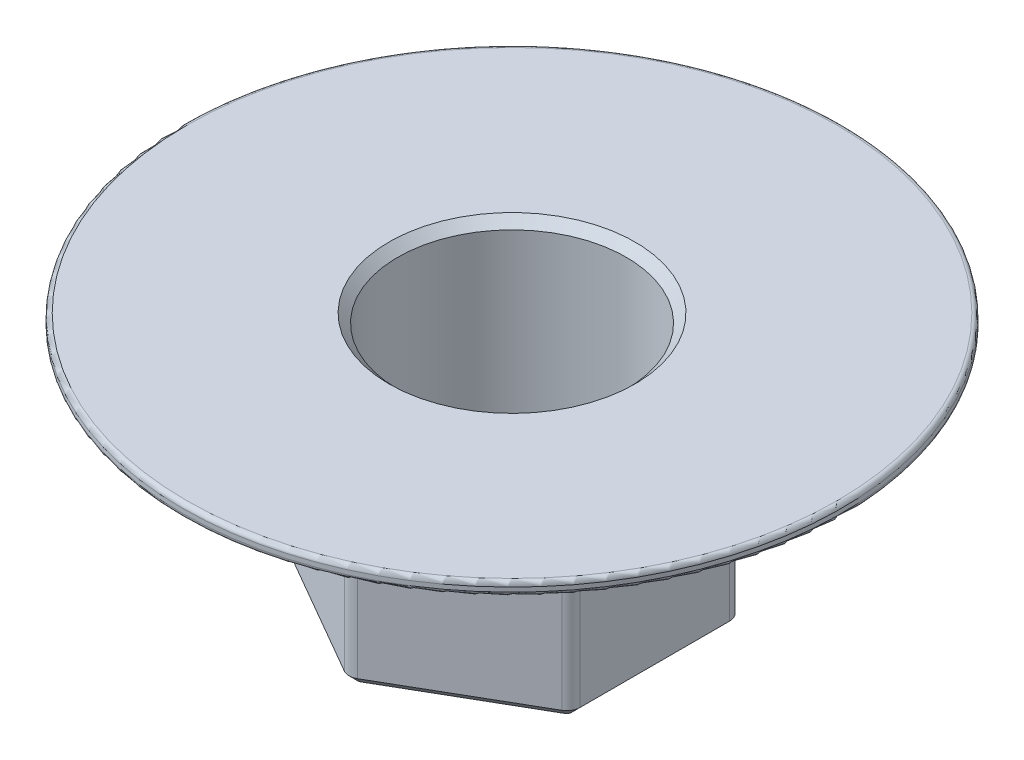
ISO-10303-21;
HEADER;
FILE_DESCRIPTION(('STEP AP214'),'2;1');
FILE_NAME('part.step','',(''),(''),'','','');
FILE_SCHEMA(('AUTOMOTIVE_DESIGN { 1 0 10303 214 1 1 1 1 }'));
ENDSEC;
DATA;
#1=APPLICATION_CONTEXT('core data for automotive mechanical design processes');
#2=APPLICATION_PROTOCOL_DEFINITION('international standard','automotive_design',2000,#1);
#3=PRODUCT_CONTEXT('',#1,'mechanical');
#4=PRODUCT('Part','Part','',(#3));
#5=PRODUCT_RELATED_PRODUCT_CATEGORY('part','',(#4));
#6=PRODUCT_DEFINITION_FORMATION('','',#4);
#7=PRODUCT_DEFINITION_CONTEXT('part definition',#1,'design');
#8=PRODUCT_DEFINITION('design','',#6,#7);
#9=PRODUCT_DEFINITION_SHAPE('','',#8);
#10=(LENGTH_UNIT() NAMED_UNIT(*) SI_UNIT(.MILLI.,.METRE.));
#11=(NAMED_UNIT(*) PLANE_ANGLE_UNIT() SI_UNIT($,.RADIAN.));
#12=(NAMED_UNIT(*) SI_UNIT($,.STERADIAN.) SOLID_ANGLE_UNIT());
#13=UNCERTAINTY_MEASURE_WITH_UNIT(LENGTH_MEASURE(1.E-05),#10,'distance_accuracy_value','');
#14=(GEOMETRIC_REPRESENTATION_CONTEXT(3) GLOBAL_UNCERTAINTY_ASSIGNED_CONTEXT((#13)) GLOBAL_UNIT_ASSIGNED_CONTEXT((#10,
#11,#12)) REPRESENTATION_CONTEXT('',''));
#15=CARTESIAN_POINT('',(0.,0.,0.));
#16=DIRECTION('',(0.,0.,1.));
#17=DIRECTION('',(1.,0.,0.));
#18=AXIS2_PLACEMENT_3D('',#15,#16,#17);
#19=CARTESIAN_POINT('',(0.,0.,0.));
#20=DIRECTION('',(0.,1.,0.));
#21=DIRECTION('',(0.,0.,1.));
#22=AXIS2_PLACEMENT_3D('',#19,#20,#21);
#23=PLANE('',#22);
#24=CARTESIAN_POINT('',(29.5,0.,-17.031832941094));
#25=DIRECTION('',(0.,1.,0.));
#26=DIRECTION('',(0.,0.,1.));
#27=AXIS2_PLACEMENT_3D('',#24,#25,#26);
#28=CIRCLE('',#27,0.999999999999997);
#29=CARTESIAN_POINT('',(30.,0.,-17.8978583448784));
#30=VERTEX_POINT('',#29);
#31=CARTESIAN_POINT('',(30.5,0.,-17.031832941094));
#32=VERTEX_POINT('',#31);
#33=EDGE_CURVE('E227',#30,#32,#28,.F.);
#34=ORIENTED_EDGE('',*,*,#33,.T.);
#35=DIRECTION('',(0.,0.,1.));
#36=VECTOR('',#35,1.);
#37=CARTESIAN_POINT('',(30.5,0.,17.031832941094));
#38=LINE('',#37,#36);
#39=CARTESIAN_POINT('',(30.5,0.,17.031832941094));
#40=VERTEX_POINT('',#39);
#41=EDGE_CURVE('E229',#32,#40,#38,.T.);
#42=ORIENTED_EDGE('',*,*,#41,.T.);
#43=CARTESIAN_POINT('',(29.5,0.,17.031832941094));
#44=DIRECTION('',(0.,1.,0.));
#45=DIRECTION('',(0.,0.,1.));
#46=AXIS2_PLACEMENT_3D('',#43,#44,#45);
#47=CIRCLE('',#46,0.999999999999998);
#48=CARTESIAN_POINT('',(30.,0.,17.8978583448784));
#49=VERTEX_POINT('',#48);
#50=EDGE_CURVE('E225',#40,#49,#47,.F.);
#51=ORIENTED_EDGE('',*,*,#50,.T.);
#52=DIRECTION('',(-0.866025403784439,0.,0.5));
#53=VECTOR('',#52,1.);
#54=CARTESIAN_POINT('',(0.499999999999995,0.,34.9296912859724));
#55=LINE('',#54,#53);
#56=CARTESIAN_POINT('',(0.500000000000002,0.,34.9296912859723));
#57=VERTEX_POINT('',#56);
#58=EDGE_CURVE('E221',#49,#57,#55,.T.);
#59=ORIENTED_EDGE('',*,*,#58,.T.);
#60=CARTESIAN_POINT('',(0.,0.,34.0636658821879));
#61=DIRECTION('',(0.,1.,0.));
#62=DIRECTION('',(0.,0.,1.));
#63=AXIS2_PLACEMENT_3D('',#60,#61,#62);
#64=CIRCLE('',#63,0.999999999999997);
#65=CARTESIAN_POINT('',(-0.499999999999999,0.,34.9296912859724));
#66=VERTEX_POINT('',#65);
#67=EDGE_CURVE('E217',#57,#66,#64,.F.);
#68=ORIENTED_EDGE('',*,*,#67,.T.);
#69=DIRECTION('',(-0.866025403784439,0.,-0.5));
#70=VECTOR('',#69,1.);
#71=CARTESIAN_POINT('',(-30.,0.,17.8978583448784));
#72=LINE('',#71,#70);
#73=CARTESIAN_POINT('',(-30.,0.,17.8978583448784));
#74=VERTEX_POINT('',#73);
#75=EDGE_CURVE('E213',#66,#74,#72,.T.);
#76=ORIENTED_EDGE('',*,*,#75,.T.);
#77=CARTESIAN_POINT('',(-29.5,0.,17.031832941094));
#78=DIRECTION('',(0.,1.,0.));
#79=DIRECTION('',(0.,0.,1.));
#80=AXIS2_PLACEMENT_3D('',#77,#78,#79);
#81=CIRCLE('',#80,0.999999999999997);
#82=CARTESIAN_POINT('',(-30.5,0.,17.031832941094));
#83=VERTEX_POINT('',#82);
#84=EDGE_CURVE('E209',#74,#83,#81,.F.);
#85=ORIENTED_EDGE('',*,*,#84,.T.);
#86=DIRECTION('',(0.,0.,-1.));
#87=VECTOR('',#86,1.);
#88=CARTESIAN_POINT('',(-30.5,0.,-17.031832941094));
#89=LINE('',#88,#87);
#90=CARTESIAN_POINT('',(-30.5,0.,-17.031832941094));
#91=VERTEX_POINT('',#90);
#92=EDGE_CURVE('E202',#83,#91,#89,.T.);
#93=ORIENTED_EDGE('',*,*,#92,.T.);
#94=CARTESIAN_POINT('',(-29.5,0.,-17.031832941094));
#95=DIRECTION('',(0.,1.,0.));
#96=DIRECTION('',(0.,0.,1.));
#97=AXIS2_PLACEMENT_3D('',#94,#95,#96);
#98=CIRCLE('',#97,0.999999999999999);
#99=CARTESIAN_POINT('',(-30.,0.,-17.8978583448784));
#100=VERTEX_POINT('',#99);
#101=EDGE_CURVE('E211',#91,#100,#98,.F.);
#102=ORIENTED_EDGE('',*,*,#101,.T.);
#103=DIRECTION('',(0.866025403784439,0.,-0.5));
#104=VECTOR('',#103,1.);
#105=CARTESIAN_POINT('',(-0.500000000000003,0.,-34.9296912859724));
#106=LINE('',#105,#104);
#107=CARTESIAN_POINT('',(-0.500000000000006,0.,-34.9296912859724));
#108=VERTEX_POINT('',#107);
#109=EDGE_CURVE('E215',#100,#108,#106,.T.);
#110=ORIENTED_EDGE('',*,*,#109,.T.);
#111=CARTESIAN_POINT('',(0.,0.,-34.0636658821879));
#112=DIRECTION('',(0.,1.,0.));
#113=DIRECTION('',(0.,0.,1.));
#114=AXIS2_PLACEMENT_3D('',#111,#112,#113);
#115=CIRCLE('',#114,0.999999999999997);
#116=CARTESIAN_POINT('',(0.499999999999989,0.,-34.9296912859724));
#117=VERTEX_POINT('',#116);
#118=EDGE_CURVE('E219',#108,#117,#115,.F.);
#119=ORIENTED_EDGE('',*,*,#118,.T.);
#120=DIRECTION('',(0.866025403784439,0.,0.5));
#121=VECTOR('',#120,1.);
#122=CARTESIAN_POINT('',(30.,0.,-17.8978583448784));
#123=LINE('',#122,#121);
#124=EDGE_CURVE('E223',#117,#30,#123,.T.);
#125=ORIENTED_EDGE('',*,*,#124,.T.);
#126=EDGE_LOOP('',(#34,#42,#51,#59,#68,#76,#85,#93,#102,#110,#119,#125));
#127=FACE_BOUND('',#126,.T.);
#128=CARTESIAN_POINT('',(0.,0.,0.));
#129=DIRECTION('',(0.,1.,0.));
#130=DIRECTION('',(0.,0.,1.));
#131=AXIS2_PLACEMENT_3D('',#128,#129,#130);
#132=CIRCLE('',#131,26.);
#133=CARTESIAN_POINT('',(0.,0.,26.));
#134=VERTEX_POINT('',#133);
#135=EDGE_CURVE('E181',#134,#134,#132,.T.);
#136=ORIENTED_EDGE('',*,*,#135,.T.);
#137=EDGE_LOOP('',(#136));
#138=FACE_BOUND('',#137,.T.);
#139=ADVANCED_FACE('F42',(#127,#138),#23,.F.);
#140=CARTESIAN_POINT('',(0.,55.,0.));
#141=DIRECTION('',(0.,1.,0.));
#142=DIRECTION('',(0.,0.,1.));
#143=AXIS2_PLACEMENT_3D('',#140,#141,#142);
#144=PLANE('',#143);
#145=CARTESIAN_POINT('',(0.,55.,0.));
#146=DIRECTION('',(0.,1.,0.));
#147=DIRECTION('',(0.,0.,1.));
#148=AXIS2_PLACEMENT_3D('',#145,#146,#147);
#149=CIRCLE('',#148,74.);
#150=CARTESIAN_POINT('',(0.,55.,74.));
#151=VERTEX_POINT('',#150);
#152=EDGE_CURVE('E12',#151,#151,#149,.T.);
#153=ORIENTED_EDGE('',*,*,#152,.T.);
#154=EDGE_LOOP('',(#153));
#155=FACE_BOUND('',#154,.T.);
#156=CARTESIAN_POINT('',(0.,55.,0.));
#157=DIRECTION('',(0.,1.,0.));
#158=DIRECTION('',(0.,0.,1.));
#159=AXIS2_PLACEMENT_3D('',#156,#157,#158);
#160=CIRCLE('',#159,28.);
#161=CARTESIAN_POINT('',(0.,55.,28.));
#162=VERTEX_POINT('',#161);
#163=EDGE_CURVE('E288',#162,#162,#160,.F.);
#164=ORIENTED_EDGE('',*,*,#163,.T.);
#165=EDGE_LOOP('',(#164));
#166=FACE_BOUND('',#165,.T.);
#167=ADVANCED_FACE('F325',(#155,#166),#144,.T.);
#168=CARTESIAN_POINT('',(0.,55.,0.));
#169=DIRECTION('',(0.,-1.,0.));
#170=DIRECTION('',(0.,0.,-1.));
#171=AXIS2_PLACEMENT_3D('',#168,#169,#170);
#172=CYLINDRICAL_SURFACE('',#171,75.);
#173=CARTESIAN_POINT('',(0.,53.,0.));
#174=DIRECTION('',(0.,1.,0.));
#175=DIRECTION('',(0.,0.,1.));
#176=AXIS2_PLACEMENT_3D('',#173,#174,#175);
#177=CIRCLE('',#176,75.);
#178=CARTESIAN_POINT('',(0.,53.,75.));
#179=VERTEX_POINT('',#178);
#180=EDGE_CURVE('E50',#179,#179,#177,.T.);
#181=ORIENTED_EDGE('',*,*,#180,.T.);
#182=EDGE_LOOP('',(#181));
#183=FACE_BOUND('',#182,.T.);
#184=CARTESIAN_POINT('',(0.,54.,0.));
#185=DIRECTION('',(0.,1.,0.));
#186=DIRECTION('',(0.,0.,1.));
#187=AXIS2_PLACEMENT_3D('',#184,#185,#186);
#188=CIRCLE('',#187,75.);
#189=CARTESIAN_POINT('',(0.,54.,75.));
#190=VERTEX_POINT('',#189);
#191=EDGE_CURVE('E294',#190,#190,#188,.F.);
#192=ORIENTED_EDGE('',*,*,#191,.T.);
#193=EDGE_LOOP('',(#192));
#194=FACE_BOUND('',#193,.T.);
#195=ADVANCED_FACE('F299',(#183,#194),#172,.T.);
#196=CARTESIAN_POINT('',(0.,55.,0.));
#197=DIRECTION('',(0.,-1.,0.));
#198=DIRECTION('',(0.,0.,-1.));
#199=AXIS2_PLACEMENT_3D('',#196,#197,#198);
#200=CYLINDRICAL_SURFACE('',#199,26.);
#201=CARTESIAN_POINT('',(0.,53.,0.));
#202=DIRECTION('',(0.,1.,0.));
#203=DIRECTION('',(0.,0.,1.));
#204=AXIS2_PLACEMENT_3D('',#201,#202,#203);
#205=CIRCLE('',#204,26.);
#206=CARTESIAN_POINT('',(0.,53.,26.));
#207=VERTEX_POINT('',#206);
#208=EDGE_CURVE('E251',#207,#207,#205,.T.);
#209=ORIENTED_EDGE('',*,*,#208,.T.);
#210=EDGE_LOOP('',(#209));
#211=FACE_BOUND('',#210,.T.);
#212=ORIENTED_EDGE('',*,*,#135,.F.);
#213=EDGE_LOOP('',(#212));
#214=FACE_BOUND('',#213,.T.);
#215=ADVANCED_FACE('F336',(#211,#214),#200,.F.);
#216=CARTESIAN_POINT('',(0.,267.132034355964,-37.5277674973257));
#217=DIRECTION('',(0.5,0.,-0.866025403784439));
#218=DIRECTION('',(-0.866025403784439,0.,-0.5));
#219=AXIS2_PLACEMENT_3D('',#216,#217,#218);
#220=PLANE('',#219);
#221=DIRECTION('',(0.,-1.,0.));
#222=VECTOR('',#221,1.);
#223=CARTESIAN_POINT('',(31.,267.132034355964,-19.6299091524473));
#224=LINE('',#223,#222);
#225=CARTESIAN_POINT('',(31.,52.,-19.6299091524473));
#226=VERTEX_POINT('',#225);
#227=CARTESIAN_POINT('',(31.,2.,-19.6299091524473));
#228=VERTEX_POINT('',#227);
#229=EDGE_CURVE('E180',#226,#228,#224,.T.);
#230=ORIENTED_EDGE('',*,*,#229,.T.);
#231=DIRECTION('',(-0.866025403784439,0.,-0.5));
#232=VECTOR('',#231,1.);
#233=CARTESIAN_POINT('',(1.49999999999999,2.,-36.6617420935412));
#234=LINE('',#233,#232);
#235=CARTESIAN_POINT('',(1.49999999999999,2.,-36.6617420935412));
#236=VERTEX_POINT('',#235);
#237=EDGE_CURVE('E176',#228,#236,#234,.T.);
#238=ORIENTED_EDGE('',*,*,#237,.T.);
#239=DIRECTION('',(0.,-1.,0.));
#240=VECTOR('',#239,1.);
#241=CARTESIAN_POINT('',(1.49999999999999,267.132034355964,-36.6617420935412));
#242=LINE('',#241,#240);
#243=CARTESIAN_POINT('',(1.49999999999999,52.,-36.6617420935412));
#244=VERTEX_POINT('',#243);
#245=EDGE_CURVE('E169',#236,#244,#242,.F.);
#246=ORIENTED_EDGE('',*,*,#245,.T.);
#247=DIRECTION('',(0.866025403784439,0.,0.5));
#248=VECTOR('',#247,1.);
#249=CARTESIAN_POINT('',(0.,52.,-37.5277674973257));
#250=LINE('',#249,#248);
#251=EDGE_CURVE('E173',#244,#226,#250,.T.);
#252=ORIENTED_EDGE('',*,*,#251,.T.);
#253=EDGE_LOOP('',(#230,#238,#246,#252));
#254=FACE_BOUND('',#253,.T.);
#255=ADVANCED_FACE('F172',(#254),#220,.T.);
#256=CARTESIAN_POINT('',(-32.5,267.132034355964,-18.7638837486628));
#257=DIRECTION('',(-0.5,0.,-0.866025403784439));
#258=DIRECTION('',(-0.866025403784439,0.,0.5));
#259=AXIS2_PLACEMENT_3D('',#256,#257,#258);
#260=PLANE('',#259);
#261=DIRECTION('',(0.,-1.,0.));
#262=VECTOR('',#261,1.);
#263=CARTESIAN_POINT('',(-1.5,267.132034355964,-36.6617420935412));
#264=LINE('',#263,#262);
#265=CARTESIAN_POINT('',(-1.5,52.,-36.6617420935412));
#266=VERTEX_POINT('',#265);
#267=CARTESIAN_POINT('',(-1.5,2.,-36.6617420935412));
#268=VERTEX_POINT('',#267);
#269=EDGE_CURVE('E197',#266,#268,#264,.T.);
#270=ORIENTED_EDGE('',*,*,#269,.T.);
#271=DIRECTION('',(-0.866025403784439,0.,0.5));
#272=VECTOR('',#271,1.);
#273=CARTESIAN_POINT('',(-31.,2.,-19.6299091524473));
#274=LINE('',#273,#272);
#275=CARTESIAN_POINT('',(-31.,2.,-19.6299091524473));
#276=VERTEX_POINT('',#275);
#277=EDGE_CURVE('E243',#268,#276,#274,.T.);
#278=ORIENTED_EDGE('',*,*,#277,.T.);
#279=DIRECTION('',(0.,-1.,0.));
#280=VECTOR('',#279,1.);
#281=CARTESIAN_POINT('',(-31.,267.132034355964,-19.6299091524473));
#282=LINE('',#281,#280);
#283=CARTESIAN_POINT('',(-31.,52.,-19.6299091524473));
#284=VERTEX_POINT('',#283);
#285=EDGE_CURVE('E482',#276,#284,#282,.F.);
#286=ORIENTED_EDGE('',*,*,#285,.T.);
#287=DIRECTION('',(0.866025403784439,0.,-0.5));
#288=VECTOR('',#287,1.);
#289=CARTESIAN_POINT('',(-32.5,52.,-18.7638837486628));
#290=LINE('',#289,#288);
#291=EDGE_CURVE('E192',#284,#266,#290,.T.);
#292=ORIENTED_EDGE('',*,*,#291,.T.);
#293=EDGE_LOOP('',(#270,#278,#286,#292));
#294=FACE_BOUND('',#293,.T.);
#295=ADVANCED_FACE('F517',(#294),#260,.T.);
#296=CARTESIAN_POINT('',(-32.5,267.132034355964,18.7638837486628));
#297=DIRECTION('',(-1.,0.,0.));
#298=DIRECTION('',(0.,0.,1.));
#299=AXIS2_PLACEMENT_3D('',#296,#297,#298);
#300=PLANE('',#299);
#301=DIRECTION('',(0.,-1.,0.));
#302=VECTOR('',#301,1.);
#303=CARTESIAN_POINT('',(-32.5,267.132034355964,-17.031832941094));
#304=LINE('',#303,#302);
#305=CARTESIAN_POINT('',(-32.5,52.,-17.031832941094));
#306=VERTEX_POINT('',#305);
#307=CARTESIAN_POINT('',(-32.5,2.,-17.031832941094));
#308=VERTEX_POINT('',#307);
#309=EDGE_CURVE('E477',#306,#308,#304,.T.);
#310=ORIENTED_EDGE('',*,*,#309,.T.);
#311=DIRECTION('',(0.,0.,1.));
#312=VECTOR('',#311,1.);
#313=CARTESIAN_POINT('',(-32.5,2.,17.031832941094));
#314=LINE('',#313,#312);
#315=CARTESIAN_POINT('',(-32.5,2.,17.031832941094));
#316=VERTEX_POINT('',#315);
#317=EDGE_CURVE('E57',#308,#316,#314,.T.);
#318=ORIENTED_EDGE('',*,*,#317,.T.);
#319=DIRECTION('',(0.,-1.,0.));
#320=VECTOR('',#319,1.);
#321=CARTESIAN_POINT('',(-32.5,267.132034355964,17.031832941094));
#322=LINE('',#321,#320);
#323=CARTESIAN_POINT('',(-32.5,52.,17.031832941094));
#324=VERTEX_POINT('',#323);
#325=EDGE_CURVE('E479',#316,#324,#322,.F.);
#326=ORIENTED_EDGE('',*,*,#325,.T.);
#327=DIRECTION('',(0.,0.,-1.));
#328=VECTOR('',#327,1.);
#329=CARTESIAN_POINT('',(-32.5,52.,18.7638837486628));
#330=LINE('',#329,#328);
#331=EDGE_CURVE('E453',#324,#306,#330,.T.);
#332=ORIENTED_EDGE('',*,*,#331,.T.);
#333=EDGE_LOOP('',(#310,#318,#326,#332));
#334=FACE_BOUND('',#333,.T.);
#335=ADVANCED_FACE('F520',(#334),#300,.T.);
#336=CARTESIAN_POINT('',(0.,267.132034355964,37.5277674973257));
#337=DIRECTION('',(-0.5,0.,0.866025403784439));
#338=DIRECTION('',(0.866025403784439,0.,0.5));
#339=AXIS2_PLACEMENT_3D('',#336,#337,#338);
#340=PLANE('',#339);
#341=DIRECTION('',(0.,-1.,0.));
#342=VECTOR('',#341,1.);
#343=CARTESIAN_POINT('',(-31.,267.132034355964,19.6299091524473));
#344=LINE('',#343,#342);
#345=CARTESIAN_POINT('',(-31.,52.,19.6299091524473));
#346=VERTEX_POINT('',#345);
#347=CARTESIAN_POINT('',(-31.,2.,19.6299091524473));
#348=VERTEX_POINT('',#347);
#349=EDGE_CURVE('E472',#346,#348,#344,.T.);
#350=ORIENTED_EDGE('',*,*,#349,.T.);
#351=DIRECTION('',(0.866025403784439,0.,0.5));
#352=VECTOR('',#351,1.);
#353=CARTESIAN_POINT('',(-1.5,2.,36.6617420935412));
#354=LINE('',#353,#352);
#355=CARTESIAN_POINT('',(-1.5,2.,36.6617420935412));
#356=VERTEX_POINT('',#355);
#357=EDGE_CURVE('E245',#348,#356,#354,.T.);
#358=ORIENTED_EDGE('',*,*,#357,.T.);
#359=DIRECTION('',(0.,-1.,0.));
#360=VECTOR('',#359,1.);
#361=CARTESIAN_POINT('',(-1.5,267.132034355964,36.6617420935412));
#362=LINE('',#361,#360);
#363=CARTESIAN_POINT('',(-1.5,52.,36.6617420935412));
#364=VERTEX_POINT('',#363);
#365=EDGE_CURVE('E475',#356,#364,#362,.F.);
#366=ORIENTED_EDGE('',*,*,#365,.T.);
#367=DIRECTION('',(-0.866025403784439,0.,-0.5));
#368=VECTOR('',#367,1.);
#369=CARTESIAN_POINT('',(0.,52.,37.5277674973257));
#370=LINE('',#369,#368);
#371=EDGE_CURVE('E456',#364,#346,#370,.T.);
#372=ORIENTED_EDGE('',*,*,#371,.T.);
#373=EDGE_LOOP('',(#350,#358,#366,#372));
#374=FACE_BOUND('',#373,.T.);
#375=ADVANCED_FACE('F495',(#374),#340,.T.);
#376=CARTESIAN_POINT('',(32.5,267.132034355964,18.7638837486628));
#377=DIRECTION('',(0.5,0.,0.866025403784439));
#378=DIRECTION('',(0.866025403784439,0.,-0.5));
#379=AXIS2_PLACEMENT_3D('',#376,#377,#378);
#380=PLANE('',#379);
#381=DIRECTION('',(0.,-1.,0.));
#382=VECTOR('',#381,1.);
#383=CARTESIAN_POINT('',(1.5,267.132034355964,36.6617420935412));
#384=LINE('',#383,#382);
#385=CARTESIAN_POINT('',(1.49999999999999,52.,36.6617420935412));
#386=VERTEX_POINT('',#385);
#387=CARTESIAN_POINT('',(1.5,2.,36.6617420935412));
#388=VERTEX_POINT('',#387);
#389=EDGE_CURVE('E467',#386,#388,#384,.T.);
#390=ORIENTED_EDGE('',*,*,#389,.T.);
#391=DIRECTION('',(0.866025403784439,0.,-0.5));
#392=VECTOR('',#391,1.);
#393=CARTESIAN_POINT('',(31.,2.,19.6299091524473));
#394=LINE('',#393,#392);
#395=CARTESIAN_POINT('',(31.,2.,19.6299091524473));
#396=VERTEX_POINT('',#395);
#397=EDGE_CURVE('E237',#388,#396,#394,.T.);
#398=ORIENTED_EDGE('',*,*,#397,.T.);
#399=DIRECTION('',(0.,-1.,0.));
#400=VECTOR('',#399,1.);
#401=CARTESIAN_POINT('',(31.,267.132034355964,19.6299091524473));
#402=LINE('',#401,#400);
#403=CARTESIAN_POINT('',(31.,52.,19.6299091524473));
#404=VERTEX_POINT('',#403);
#405=EDGE_CURVE('E470',#396,#404,#402,.F.);
#406=ORIENTED_EDGE('',*,*,#405,.T.);
#407=DIRECTION('',(-0.866025403784439,0.,0.5));
#408=VECTOR('',#407,1.);
#409=CARTESIAN_POINT('',(32.5,52.,18.7638837486628));
#410=LINE('',#409,#408);
#411=EDGE_CURVE('E498',#404,#386,#410,.T.);
#412=ORIENTED_EDGE('',*,*,#411,.T.);
#413=EDGE_LOOP('',(#390,#398,#406,#412));
#414=FACE_BOUND('',#413,.T.);
#415=ADVANCED_FACE('F319',(#414),#380,.T.);
#416=CARTESIAN_POINT('',(32.5,267.132034355964,-18.7638837486629));
#417=DIRECTION('',(1.,0.,0.));
#418=DIRECTION('',(0.,0.,-1.));
#419=AXIS2_PLACEMENT_3D('',#416,#417,#418);
#420=PLANE('',#419);
#421=DIRECTION('',(0.,-1.,0.));
#422=VECTOR('',#421,1.);
#423=CARTESIAN_POINT('',(32.5,267.132034355964,17.031832941094));
#424=LINE('',#423,#422);
#425=CARTESIAN_POINT('',(32.5,52.,17.031832941094));
#426=VERTEX_POINT('',#425);
#427=CARTESIAN_POINT('',(32.5,2.,17.031832941094));
#428=VERTEX_POINT('',#427);
#429=EDGE_CURVE('E462',#426,#428,#424,.T.);
#430=ORIENTED_EDGE('',*,*,#429,.T.);
#431=DIRECTION('',(0.,0.,-1.));
#432=VECTOR('',#431,1.);
#433=CARTESIAN_POINT('',(32.5,2.,-17.031832941094));
#434=LINE('',#433,#432);
#435=CARTESIAN_POINT('',(32.5,2.,-17.031832941094));
#436=VERTEX_POINT('',#435);
#437=EDGE_CURVE('E198',#428,#436,#434,.T.);
#438=ORIENTED_EDGE('',*,*,#437,.T.);
#439=DIRECTION('',(0.,-1.,0.));
#440=VECTOR('',#439,1.);
#441=CARTESIAN_POINT('',(32.5,267.132034355964,-17.031832941094));
#442=LINE('',#441,#440);
#443=CARTESIAN_POINT('',(32.5,52.,-17.031832941094));
#444=VERTEX_POINT('',#443);
#445=EDGE_CURVE('E465',#436,#444,#442,.F.);
#446=ORIENTED_EDGE('',*,*,#445,.T.);
#447=DIRECTION('',(0.,0.,1.));
#448=VECTOR('',#447,1.);
#449=CARTESIAN_POINT('',(32.5,52.,-18.7638837486629));
#450=LINE('',#449,#448);
#451=EDGE_CURVE('E191',#444,#426,#450,.T.);
#452=ORIENTED_EDGE('',*,*,#451,.T.);
#453=EDGE_LOOP('',(#430,#438,#446,#452));
#454=FACE_BOUND('',#453,.T.);
#455=ADVANCED_FACE('F310',(#454),#420,.T.);
#456=CARTESIAN_POINT('',(0.,52.,0.));
#457=DIRECTION('',(0.,1.,0.));
#458=DIRECTION('',(0.,0.,1.));
#459=AXIS2_PLACEMENT_3D('',#456,#457,#458);
#460=PLANE('',#459);
#461=CARTESIAN_POINT('',(0.,52.,0.));
#462=DIRECTION('',(0.,1.,0.));
#463=DIRECTION('',(0.,0.,1.));
#464=AXIS2_PLACEMENT_3D('',#461,#462,#463);
#465=CIRCLE('',#464,74.);
#466=CARTESIAN_POINT('',(0.,52.,74.));
#467=VERTEX_POINT('',#466);
#468=EDGE_CURVE('E291',#467,#467,#465,.F.);
#469=ORIENTED_EDGE('',*,*,#468,.T.);
#470=EDGE_LOOP('',(#469));
#471=FACE_BOUND('',#470,.T.);
#472=ORIENTED_EDGE('',*,*,#291,.F.);
#473=CARTESIAN_POINT('',(-29.5,52.,-17.031832941094));
#474=DIRECTION('',(0.,1.,0.));
#475=DIRECTION('',(0.,0.,1.));
#476=AXIS2_PLACEMENT_3D('',#473,#474,#475);
#477=CIRCLE('',#476,3.);
#478=EDGE_CURVE('E199',#284,#306,#477,.T.);
#479=ORIENTED_EDGE('',*,*,#478,.T.);
#480=ORIENTED_EDGE('',*,*,#331,.F.);
#481=CARTESIAN_POINT('',(-29.5,52.,17.031832941094));
#482=DIRECTION('',(0.,1.,0.));
#483=DIRECTION('',(0.,0.,1.));
#484=AXIS2_PLACEMENT_3D('',#481,#482,#483);
#485=CIRCLE('',#484,3.);
#486=EDGE_CURVE('E204',#324,#346,#485,.T.);
#487=ORIENTED_EDGE('',*,*,#486,.T.);
#488=ORIENTED_EDGE('',*,*,#371,.F.);
#489=CARTESIAN_POINT('',(0.,52.,34.0636658821879));
#490=DIRECTION('',(0.,1.,0.));
#491=DIRECTION('',(0.,0.,1.));
#492=AXIS2_PLACEMENT_3D('',#489,#490,#491);
#493=CIRCLE('',#492,3.);
#494=EDGE_CURVE('E487',#364,#386,#493,.T.);
#495=ORIENTED_EDGE('',*,*,#494,.T.);
#496=ORIENTED_EDGE('',*,*,#411,.F.);
#497=CARTESIAN_POINT('',(29.5,52.,17.031832941094));
#498=DIRECTION('',(0.,1.,0.));
#499=DIRECTION('',(0.,0.,1.));
#500=AXIS2_PLACEMENT_3D('',#497,#498,#499);
#501=CIRCLE('',#500,3.);
#502=EDGE_CURVE('E485',#404,#426,#501,.T.);
#503=ORIENTED_EDGE('',*,*,#502,.T.);
#504=ORIENTED_EDGE('',*,*,#451,.F.);
#505=CARTESIAN_POINT('',(29.5,52.,-17.031832941094));
#506=DIRECTION('',(0.,1.,0.));
#507=DIRECTION('',(0.,0.,1.));
#508=AXIS2_PLACEMENT_3D('',#505,#506,#507);
#509=CIRCLE('',#508,3.);
#510=EDGE_CURVE('E190',#444,#226,#509,.T.);
#511=ORIENTED_EDGE('',*,*,#510,.T.);
#512=ORIENTED_EDGE('',*,*,#251,.F.);
#513=CARTESIAN_POINT('',(0.,52.,-34.0636658821879));
#514=DIRECTION('',(0.,1.,0.));
#515=DIRECTION('',(0.,0.,1.));
#516=AXIS2_PLACEMENT_3D('',#513,#514,#515);
#517=CIRCLE('',#516,3.);
#518=EDGE_CURVE('E186',#244,#266,#517,.T.);
#519=ORIENTED_EDGE('',*,*,#518,.T.);
#520=EDGE_LOOP('',(#472,#479,#480,#487,#488,#495,#496,#503,#504,#511,#512,#519));
#521=FACE_BOUND('',#520,.T.);
#522=ADVANCED_FACE('F185',(#471,#521),#460,.F.);
#523=CARTESIAN_POINT('',(29.5,267.132034355964,-17.031832941094));
#524=DIRECTION('',(0.,-1.,0.));
#525=DIRECTION('',(0.,0.,-1.));
#526=AXIS2_PLACEMENT_3D('',#523,#524,#525);
#527=CYLINDRICAL_SURFACE('',#526,3.);
#528=ORIENTED_EDGE('',*,*,#445,.F.);
#529=CARTESIAN_POINT('',(29.5,2.,-17.031832941094));
#530=DIRECTION('',(0.,1.,0.));
#531=DIRECTION('',(0.,0.,1.));
#532=AXIS2_PLACEMENT_3D('',#529,#530,#531);
#533=CIRCLE('',#532,3.);
#534=EDGE_CURVE('E232',#436,#228,#533,.T.);
#535=ORIENTED_EDGE('',*,*,#534,.T.);
#536=ORIENTED_EDGE('',*,*,#229,.F.);
#537=ORIENTED_EDGE('',*,*,#510,.F.);
#538=EDGE_LOOP('',(#528,#535,#536,#537));
#539=FACE_BOUND('',#538,.T.);
#540=ADVANCED_FACE('F309',(#539),#527,.T.);
#541=CARTESIAN_POINT('',(29.5,267.132034355964,17.031832941094));
#542=DIRECTION('',(0.,-1.,0.));
#543=DIRECTION('',(0.,0.,-1.));
#544=AXIS2_PLACEMENT_3D('',#541,#542,#543);
#545=CYLINDRICAL_SURFACE('',#544,3.);
#546=ORIENTED_EDGE('',*,*,#405,.F.);
#547=CARTESIAN_POINT('',(29.5,2.,17.031832941094));
#548=DIRECTION('',(0.,1.,0.));
#549=DIRECTION('',(0.,0.,1.));
#550=AXIS2_PLACEMENT_3D('',#547,#548,#549);
#551=CIRCLE('',#550,3.);
#552=EDGE_CURVE('E234',#396,#428,#551,.T.);
#553=ORIENTED_EDGE('',*,*,#552,.T.);
#554=ORIENTED_EDGE('',*,*,#429,.F.);
#555=ORIENTED_EDGE('',*,*,#502,.F.);
#556=EDGE_LOOP('',(#546,#553,#554,#555));
#557=FACE_BOUND('',#556,.T.);
#558=ADVANCED_FACE('F316',(#557),#545,.T.);
#559=CARTESIAN_POINT('',(0.,267.132034355964,34.0636658821879));
#560=DIRECTION('',(0.,-1.,0.));
#561=DIRECTION('',(0.,0.,-1.));
#562=AXIS2_PLACEMENT_3D('',#559,#560,#561);
#563=CYLINDRICAL_SURFACE('',#562,3.);
#564=ORIENTED_EDGE('',*,*,#365,.F.);
#565=CARTESIAN_POINT('',(0.,2.,34.0636658821879));
#566=DIRECTION('',(0.,1.,0.));
#567=DIRECTION('',(0.,0.,1.));
#568=AXIS2_PLACEMENT_3D('',#565,#566,#567);
#569=CIRCLE('',#568,3.);
#570=EDGE_CURVE('E241',#356,#388,#569,.T.);
#571=ORIENTED_EDGE('',*,*,#570,.T.);
#572=ORIENTED_EDGE('',*,*,#389,.F.);
#573=ORIENTED_EDGE('',*,*,#494,.F.);
#574=EDGE_LOOP('',(#564,#571,#572,#573));
#575=FACE_BOUND('',#574,.T.);
#576=ADVANCED_FACE('F340',(#575),#563,.T.);
#577=CARTESIAN_POINT('',(-29.5,267.132034355964,17.031832941094));
#578=DIRECTION('',(0.,-1.,0.));
#579=DIRECTION('',(0.,0.,-1.));
#580=AXIS2_PLACEMENT_3D('',#577,#578,#579);
#581=CYLINDRICAL_SURFACE('',#580,3.);
#582=ORIENTED_EDGE('',*,*,#325,.F.);
#583=CARTESIAN_POINT('',(-29.5,2.,17.031832941094));
#584=DIRECTION('',(0.,1.,0.));
#585=DIRECTION('',(0.,0.,1.));
#586=AXIS2_PLACEMENT_3D('',#583,#584,#585);
#587=CIRCLE('',#586,3.);
#588=EDGE_CURVE('E248',#316,#348,#587,.T.);
#589=ORIENTED_EDGE('',*,*,#588,.T.);
#590=ORIENTED_EDGE('',*,*,#349,.F.);
#591=ORIENTED_EDGE('',*,*,#486,.F.);
#592=EDGE_LOOP('',(#582,#589,#590,#591));
#593=FACE_BOUND('',#592,.T.);
#594=ADVANCED_FACE('F344',(#593),#581,.T.);
#595=CARTESIAN_POINT('',(-29.5,267.132034355964,-17.031832941094));
#596=DIRECTION('',(0.,-1.,0.));
#597=DIRECTION('',(0.,0.,-1.));
#598=AXIS2_PLACEMENT_3D('',#595,#596,#597);
#599=CYLINDRICAL_SURFACE('',#598,3.);
#600=ORIENTED_EDGE('',*,*,#285,.F.);
#601=CARTESIAN_POINT('',(-29.5,2.,-17.031832941094));
#602=DIRECTION('',(0.,1.,0.));
#603=DIRECTION('',(0.,0.,1.));
#604=AXIS2_PLACEMENT_3D('',#601,#602,#603);
#605=CIRCLE('',#604,3.);
#606=EDGE_CURVE('E65',#276,#308,#605,.T.);
#607=ORIENTED_EDGE('',*,*,#606,.T.);
#608=ORIENTED_EDGE('',*,*,#309,.F.);
#609=ORIENTED_EDGE('',*,*,#478,.F.);
#610=EDGE_LOOP('',(#600,#607,#608,#609));
#611=FACE_BOUND('',#610,.T.);
#612=ADVANCED_FACE('F348',(#611),#599,.T.);
#613=CARTESIAN_POINT('',(0.,267.132034355964,-34.0636658821879));
#614=DIRECTION('',(0.,-1.,0.));
#615=DIRECTION('',(0.,0.,-1.));
#616=AXIS2_PLACEMENT_3D('',#613,#614,#615);
#617=CYLINDRICAL_SURFACE('',#616,3.);
#618=ORIENTED_EDGE('',*,*,#245,.F.);
#619=CARTESIAN_POINT('',(0.,2.,-34.0636658821879));
#620=DIRECTION('',(0.,1.,0.));
#621=DIRECTION('',(0.,0.,1.));
#622=AXIS2_PLACEMENT_3D('',#619,#620,#621);
#623=CIRCLE('',#622,3.);
#624=EDGE_CURVE('E239',#236,#268,#623,.T.);
#625=ORIENTED_EDGE('',*,*,#624,.T.);
#626=ORIENTED_EDGE('',*,*,#269,.F.);
#627=ORIENTED_EDGE('',*,*,#518,.F.);
#628=EDGE_LOOP('',(#618,#625,#626,#627));
#629=FACE_BOUND('',#628,.T.);
#630=ADVANCED_FACE('F195',(#629),#617,.T.);
#631=CARTESIAN_POINT('',(-32.5,2.,18.7638837486628));
#632=DIRECTION('',(-0.707106781186547,-0.707106781186547,0.));
#633=DIRECTION('',(0.,0.,-1.));
#634=AXIS2_PLACEMENT_3D('',#631,#632,#633);
#635=PLANE('',#634);
#636=DIRECTION('',(-0.707106781186547,0.707106781186547,0.));
#637=VECTOR('',#636,1.);
#638=CARTESIAN_POINT('',(-30.5,0.,-17.031832941094));
#639=LINE('',#638,#637);
#640=EDGE_CURVE('E280',#91,#308,#639,.T.);
#641=ORIENTED_EDGE('',*,*,#640,.F.);
#642=ORIENTED_EDGE('',*,*,#92,.F.);
#643=DIRECTION('',(0.707106781186547,-0.707106781186547,0.));
#644=VECTOR('',#643,1.);
#645=CARTESIAN_POINT('',(-32.5,2.,17.031832941094));
#646=LINE('',#645,#644);
#647=EDGE_CURVE('E283',#316,#83,#646,.T.);
#648=ORIENTED_EDGE('',*,*,#647,.F.);
#649=ORIENTED_EDGE('',*,*,#317,.F.);
#650=EDGE_LOOP('',(#641,#642,#648,#649));
#651=FACE_BOUND('',#650,.T.);
#652=ADVANCED_FACE('F354',(#651),#635,.T.);
#653=CARTESIAN_POINT('',(-29.5,0.,17.031832941094));
#654=DIRECTION('',(0.,1.,0.));
#655=DIRECTION('',(0.,0.,1.));
#656=AXIS2_PLACEMENT_3D('',#653,#654,#655);
#657=CONICAL_SURFACE('',#656,0.999999999999997,0.785398163397449);
#658=ORIENTED_EDGE('',*,*,#647,.T.);
#659=ORIENTED_EDGE('',*,*,#84,.F.);
#660=DIRECTION('',(0.353553390593275,-0.707106781186547,-0.612372435695794));
#661=VECTOR('',#660,1.);
#662=CARTESIAN_POINT('',(-31.,2.,19.6299091524473));
#663=LINE('',#662,#661);
#664=EDGE_CURVE('E277',#348,#74,#663,.T.);
#665=ORIENTED_EDGE('',*,*,#664,.F.);
#666=ORIENTED_EDGE('',*,*,#588,.F.);
#667=EDGE_LOOP('',(#658,#659,#665,#666));
#668=FACE_BOUND('',#667,.T.);
#669=ADVANCED_FACE('F426',(#668),#657,.T.);
#670=CARTESIAN_POINT('',(-29.5,0.,-17.031832941094));
#671=DIRECTION('',(0.,1.,0.));
#672=DIRECTION('',(0.,0.,1.));
#673=AXIS2_PLACEMENT_3D('',#670,#671,#672);
#674=CONICAL_SURFACE('',#673,0.999999999999999,0.785398163397448);
#675=ORIENTED_EDGE('',*,*,#640,.T.);
#676=ORIENTED_EDGE('',*,*,#606,.F.);
#677=DIRECTION('',(-0.353553390593273,0.707106781186548,-0.612372435695795));
#678=VECTOR('',#677,1.);
#679=CARTESIAN_POINT('',(-30.,0.,-17.8978583448784));
#680=LINE('',#679,#678);
#681=EDGE_CURVE('E274',#100,#276,#680,.T.);
#682=ORIENTED_EDGE('',*,*,#681,.F.);
#683=ORIENTED_EDGE('',*,*,#101,.F.);
#684=EDGE_LOOP('',(#675,#676,#682,#683));
#685=FACE_BOUND('',#684,.T.);
#686=ADVANCED_FACE('F419',(#685),#674,.T.);
#687=CARTESIAN_POINT('',(0.,2.,37.5277674973257));
#688=DIRECTION('',(-0.353553390593274,-0.707106781186547,0.612372435695795));
#689=DIRECTION('',(-0.866025403784439,0.,-0.5));
#690=AXIS2_PLACEMENT_3D('',#687,#688,#689);
#691=PLANE('',#690);
#692=ORIENTED_EDGE('',*,*,#664,.T.);
#693=ORIENTED_EDGE('',*,*,#75,.F.);
#694=DIRECTION('',(0.353553390593273,-0.707106781186548,-0.612372435695795));
#695=VECTOR('',#694,1.);
#696=CARTESIAN_POINT('',(-1.5,2.,36.6617420935412));
#697=LINE('',#696,#695);
#698=EDGE_CURVE('E271',#356,#66,#697,.T.);
#699=ORIENTED_EDGE('',*,*,#698,.F.);
#700=ORIENTED_EDGE('',*,*,#357,.F.);
#701=EDGE_LOOP('',(#692,#693,#699,#700));
#702=FACE_BOUND('',#701,.T.);
#703=ADVANCED_FACE('F412',(#702),#691,.T.);
#704=CARTESIAN_POINT('',(-32.5,2.,-18.7638837486628));
#705=DIRECTION('',(-0.353553390593274,-0.707106781186547,-0.612372435695795));
#706=DIRECTION('',(0.866025403784439,0.,-0.5));
#707=AXIS2_PLACEMENT_3D('',#704,#705,#706);
#708=PLANE('',#707);
#709=ORIENTED_EDGE('',*,*,#681,.T.);
#710=ORIENTED_EDGE('',*,*,#277,.F.);
#711=DIRECTION('',(-0.353553390593273,0.707106781186549,-0.612372435695793));
#712=VECTOR('',#711,1.);
#713=CARTESIAN_POINT('',(-0.500000000000006,0.,-34.9296912859724));
#714=LINE('',#713,#712);
#715=EDGE_CURVE('E268',#108,#268,#714,.T.);
#716=ORIENTED_EDGE('',*,*,#715,.F.);
#717=ORIENTED_EDGE('',*,*,#109,.F.);
#718=EDGE_LOOP('',(#709,#710,#716,#717));
#719=FACE_BOUND('',#718,.T.);
#720=ADVANCED_FACE('F405',(#719),#708,.T.);
#721=CARTESIAN_POINT('',(0.,0.,34.0636658821879));
#722=DIRECTION('',(0.,1.,0.));
#723=DIRECTION('',(0.,0.,1.));
#724=AXIS2_PLACEMENT_3D('',#721,#722,#723);
#725=CONICAL_SURFACE('',#724,0.999999999999997,0.785398163397449);
#726=ORIENTED_EDGE('',*,*,#698,.T.);
#727=ORIENTED_EDGE('',*,*,#67,.F.);
#728=DIRECTION('',(-0.353553390593274,-0.707106781186548,-0.612372435695795));
#729=VECTOR('',#728,1.);
#730=CARTESIAN_POINT('',(1.5,2.,36.6617420935412));
#731=LINE('',#730,#729);
#732=EDGE_CURVE('E265',#388,#57,#731,.T.);
#733=ORIENTED_EDGE('',*,*,#732,.F.);
#734=ORIENTED_EDGE('',*,*,#570,.F.);
#735=EDGE_LOOP('',(#726,#727,#733,#734));
#736=FACE_BOUND('',#735,.T.);
#737=ADVANCED_FACE('F398',(#736),#725,.T.);
#738=CARTESIAN_POINT('',(0.,0.,-34.0636658821879));
#739=DIRECTION('',(0.,1.,0.));
#740=DIRECTION('',(0.,0.,1.));
#741=AXIS2_PLACEMENT_3D('',#738,#739,#740);
#742=CONICAL_SURFACE('',#741,0.999999999999997,0.785398163397449);
#743=ORIENTED_EDGE('',*,*,#715,.T.);
#744=ORIENTED_EDGE('',*,*,#624,.F.);
#745=DIRECTION('',(0.353553390593274,0.707106781186547,-0.612372435695795));
#746=VECTOR('',#745,1.);
#747=CARTESIAN_POINT('',(0.499999999999989,0.,-34.9296912859724));
#748=LINE('',#747,#746);
#749=EDGE_CURVE('E262',#117,#236,#748,.T.);
#750=ORIENTED_EDGE('',*,*,#749,.F.);
#751=ORIENTED_EDGE('',*,*,#118,.F.);
#752=EDGE_LOOP('',(#743,#744,#750,#751));
#753=FACE_BOUND('',#752,.T.);
#754=ADVANCED_FACE('F391',(#753),#742,.T.);
#755=CARTESIAN_POINT('',(32.5,2.,18.7638837486628));
#756=DIRECTION('',(0.353553390593273,-0.707106781186548,0.612372435695794));
#757=DIRECTION('',(-0.866025403784439,0.,0.5));
#758=AXIS2_PLACEMENT_3D('',#755,#756,#757);
#759=PLANE('',#758);
#760=ORIENTED_EDGE('',*,*,#732,.T.);
#761=ORIENTED_EDGE('',*,*,#58,.F.);
#762=DIRECTION('',(-0.353553390593274,-0.707106781186547,-0.612372435695794));
#763=VECTOR('',#762,1.);
#764=CARTESIAN_POINT('',(31.,2.,19.6299091524473));
#765=LINE('',#764,#763);
#766=EDGE_CURVE('E259',#396,#49,#765,.T.);
#767=ORIENTED_EDGE('',*,*,#766,.F.);
#768=ORIENTED_EDGE('',*,*,#397,.F.);
#769=EDGE_LOOP('',(#760,#761,#767,#768));
#770=FACE_BOUND('',#769,.T.);
#771=ADVANCED_FACE('F384',(#770),#759,.T.);
#772=CARTESIAN_POINT('',(0.,2.,-37.5277674973257));
#773=DIRECTION('',(0.353553390593274,-0.707106781186547,-0.612372435695795));
#774=DIRECTION('',(0.866025403784439,0.,0.5));
#775=AXIS2_PLACEMENT_3D('',#772,#773,#774);
#776=PLANE('',#775);
#777=ORIENTED_EDGE('',*,*,#749,.T.);
#778=ORIENTED_EDGE('',*,*,#237,.F.);
#779=DIRECTION('',(0.353553390593275,0.707106781186548,-0.612372435695793));
#780=VECTOR('',#779,1.);
#781=CARTESIAN_POINT('',(30.,0.,-17.8978583448784));
#782=LINE('',#781,#780);
#783=EDGE_CURVE('E256',#30,#228,#782,.T.);
#784=ORIENTED_EDGE('',*,*,#783,.F.);
#785=ORIENTED_EDGE('',*,*,#124,.F.);
#786=EDGE_LOOP('',(#777,#778,#784,#785));
#787=FACE_BOUND('',#786,.T.);
#788=ADVANCED_FACE('F377',(#787),#776,.T.);
#789=CARTESIAN_POINT('',(29.5,0.,17.031832941094));
#790=DIRECTION('',(0.,1.,0.));
#791=DIRECTION('',(0.,0.,1.));
#792=AXIS2_PLACEMENT_3D('',#789,#790,#791);
#793=CONICAL_SURFACE('',#792,0.999999999999999,0.785398163397448);
#794=ORIENTED_EDGE('',*,*,#766,.T.);
#795=ORIENTED_EDGE('',*,*,#50,.F.);
#796=DIRECTION('',(-0.707106781186548,-0.707106781186547,0.));
#797=VECTOR('',#796,1.);
#798=CARTESIAN_POINT('',(32.5,2.,17.031832941094));
#799=LINE('',#798,#797);
#800=EDGE_CURVE('E254',#428,#40,#799,.T.);
#801=ORIENTED_EDGE('',*,*,#800,.F.);
#802=ORIENTED_EDGE('',*,*,#552,.F.);
#803=EDGE_LOOP('',(#794,#795,#801,#802));
#804=FACE_BOUND('',#803,.T.);
#805=ADVANCED_FACE('F370',(#804),#793,.T.);
#806=CARTESIAN_POINT('',(29.5,0.,-17.031832941094));
#807=DIRECTION('',(0.,1.,0.));
#808=DIRECTION('',(0.,0.,1.));
#809=AXIS2_PLACEMENT_3D('',#806,#807,#808);
#810=CONICAL_SURFACE('',#809,0.999999999999997,0.785398163397449);
#811=ORIENTED_EDGE('',*,*,#783,.T.);
#812=ORIENTED_EDGE('',*,*,#534,.F.);
#813=DIRECTION('',(0.707106781186548,0.707106781186547,0.));
#814=VECTOR('',#813,1.);
#815=CARTESIAN_POINT('',(30.5,0.,-17.031832941094));
#816=LINE('',#815,#814);
#817=EDGE_CURVE('E252',#32,#436,#816,.T.);
#818=ORIENTED_EDGE('',*,*,#817,.F.);
#819=ORIENTED_EDGE('',*,*,#33,.F.);
#820=EDGE_LOOP('',(#811,#812,#818,#819));
#821=FACE_BOUND('',#820,.T.);
#822=ADVANCED_FACE('F363',(#821),#810,.T.);
#823=CARTESIAN_POINT('',(32.5,2.,-18.7638837486629));
#824=DIRECTION('',(0.707106781186547,-0.707106781186547,0.));
#825=DIRECTION('',(0.,0.,1.));
#826=AXIS2_PLACEMENT_3D('',#823,#824,#825);
#827=PLANE('',#826);
#828=ORIENTED_EDGE('',*,*,#800,.T.);
#829=ORIENTED_EDGE('',*,*,#41,.F.);
#830=ORIENTED_EDGE('',*,*,#817,.T.);
#831=ORIENTED_EDGE('',*,*,#437,.F.);
#832=EDGE_LOOP('',(#828,#829,#830,#831));
#833=FACE_BOUND('',#832,.T.);
#834=ADVANCED_FACE('F356',(#833),#827,.T.);
#835=CARTESIAN_POINT('',(0.,53.,0.));
#836=DIRECTION('',(0.,1.,0.));
#837=DIRECTION('',(0.,0.,1.));
#838=AXIS2_PLACEMENT_3D('',#835,#836,#837);
#839=CONICAL_SURFACE('',#838,26.,0.785398163397453);
#840=ORIENTED_EDGE('',*,*,#163,.F.);
#841=EDGE_LOOP('',(#840));
#842=FACE_BOUND('',#841,.T.);
#843=ORIENTED_EDGE('',*,*,#208,.F.);
#844=EDGE_LOOP('',(#843));
#845=FACE_BOUND('',#844,.T.);
#846=ADVANCED_FACE('F305',(#842,#845),#839,.F.);
#847=CARTESIAN_POINT('',(0.,53.,0.));
#848=DIRECTION('',(0.,1.,0.));
#849=DIRECTION('',(0.,0.,1.));
#850=AXIS2_PLACEMENT_3D('',#847,#848,#849);
#851=TOROIDAL_SURFACE('',#850,74.,1.);
#852=ORIENTED_EDGE('',*,*,#180,.F.);
#853=EDGE_LOOP('',(#852));
#854=FACE_BOUND('',#853,.T.);
#855=ORIENTED_EDGE('',*,*,#468,.F.);
#856=EDGE_LOOP('',(#855));
#857=FACE_BOUND('',#856,.T.);
#858=ADVANCED_FACE('F302',(#854,#857),#851,.T.);
#859=CARTESIAN_POINT('',(0.,54.,0.));
#860=DIRECTION('',(0.,1.,0.));
#861=DIRECTION('',(0.,0.,1.));
#862=AXIS2_PLACEMENT_3D('',#859,#860,#861);
#863=TOROIDAL_SURFACE('',#862,74.,1.);
#864=ORIENTED_EDGE('',*,*,#191,.F.);
#865=EDGE_LOOP('',(#864));
#866=FACE_BOUND('',#865,.T.);
#867=ORIENTED_EDGE('',*,*,#152,.F.);
#868=EDGE_LOOP('',(#867));
#869=FACE_BOUND('',#868,.T.);
#870=ADVANCED_FACE('F44',(#866,#869),#863,.T.);
#871=CLOSED_SHELL('',(#139,#167,#195,#215,#255,#295,#335,#375,#415,#455,#522,#540,#558,#576,
#594,#612,#630,#652,#669,#686,#703,#720,#737,#754,#771,#788,#805,#822,#834,#846,#858,#870));
#872=MANIFOLD_SOLID_BREP('B2',#871);
#873=ADVANCED_BREP_SHAPE_REPRESENTATION('',(#18,#872),#14);
#874=SHAPE_DEFINITION_REPRESENTATION(#9,#873);
ENDSEC;
END-ISO-10303-21;
